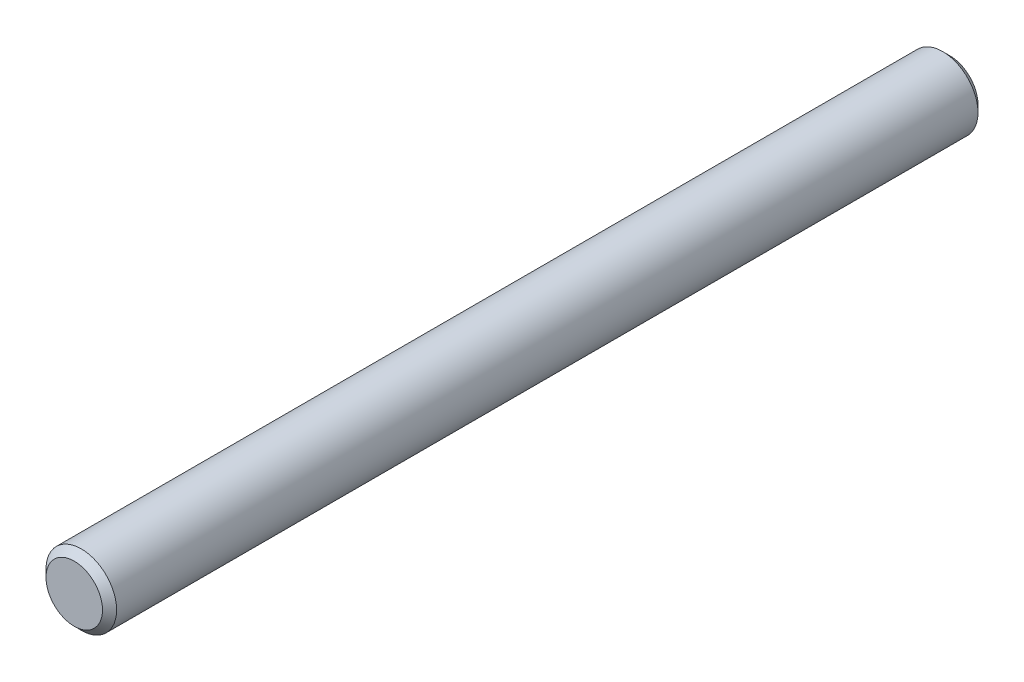
ISO-10303-21;
HEADER;
FILE_DESCRIPTION(('STEP AP214'),'2;1');
FILE_NAME('part.step','',(''),(''),'','','');
FILE_SCHEMA(('AUTOMOTIVE_DESIGN { 1 0 10303 214 1 1 1 1 }'));
ENDSEC;
DATA;
#1=APPLICATION_CONTEXT('core data for automotive mechanical design processes');
#2=APPLICATION_PROTOCOL_DEFINITION('international standard','automotive_design',2000,#1);
#3=PRODUCT_CONTEXT('',#1,'mechanical');
#4=PRODUCT('Part','Part','',(#3));
#5=PRODUCT_RELATED_PRODUCT_CATEGORY('part','',(#4));
#6=PRODUCT_DEFINITION_FORMATION('','',#4);
#7=PRODUCT_DEFINITION_CONTEXT('part definition',#1,'design');
#8=PRODUCT_DEFINITION('design','',#6,#7);
#9=PRODUCT_DEFINITION_SHAPE('','',#8);
#10=(LENGTH_UNIT() NAMED_UNIT(*) SI_UNIT(.MILLI.,.METRE.));
#11=(NAMED_UNIT(*) PLANE_ANGLE_UNIT() SI_UNIT($,.RADIAN.));
#12=(NAMED_UNIT(*) SI_UNIT($,.STERADIAN.) SOLID_ANGLE_UNIT());
#13=UNCERTAINTY_MEASURE_WITH_UNIT(LENGTH_MEASURE(1.E-05),#10,'distance_accuracy_value','');
#14=(GEOMETRIC_REPRESENTATION_CONTEXT(3) GLOBAL_UNCERTAINTY_ASSIGNED_CONTEXT((#13)) GLOBAL_UNIT_ASSIGNED_CONTEXT((#10,
#11,#12)) REPRESENTATION_CONTEXT('',''));
#15=CARTESIAN_POINT('',(0.,0.,0.));
#16=DIRECTION('',(0.,0.,1.));
#17=DIRECTION('',(1.,0.,0.));
#18=AXIS2_PLACEMENT_3D('',#15,#16,#17);
#19=CARTESIAN_POINT('',(0.,0.,62.));
#20=DIRECTION('',(0.,0.,-1.));
#21=DIRECTION('',(-1.,0.,0.));
#22=AXIS2_PLACEMENT_3D('',#19,#20,#21);
#23=CYLINDRICAL_SURFACE('',#22,2.5);
#24=CARTESIAN_POINT('',(0.,0.,0.49999999999998));
#25=DIRECTION('',(0.,0.,1.));
#26=DIRECTION('',(1.,0.,0.));
#27=AXIS2_PLACEMENT_3D('',#24,#25,#26);
#28=CIRCLE('',#27,2.5);
#29=CARTESIAN_POINT('',(2.5,0.,0.49999999999998));
#30=VERTEX_POINT('',#29);
#31=EDGE_CURVE('E41',#30,#30,#28,.T.);
#32=ORIENTED_EDGE('',*,*,#31,.T.);
#33=EDGE_LOOP('',(#32));
#34=FACE_BOUND('',#33,.T.);
#35=CARTESIAN_POINT('',(0.,0.,61.5));
#36=DIRECTION('',(0.,0.,1.));
#37=DIRECTION('',(1.,0.,0.));
#38=AXIS2_PLACEMENT_3D('',#35,#36,#37);
#39=CIRCLE('',#38,2.5);
#40=CARTESIAN_POINT('',(2.5,0.,61.5));
#41=VERTEX_POINT('',#40);
#42=EDGE_CURVE('E45',#41,#41,#39,.F.);
#43=ORIENTED_EDGE('',*,*,#42,.T.);
#44=EDGE_LOOP('',(#43));
#45=FACE_BOUND('',#44,.T.);
#46=ADVANCED_FACE('F30',(#34,#45),#23,.T.);
#47=CARTESIAN_POINT('',(0.,0.,62.));
#48=DIRECTION('',(0.,0.,1.));
#49=DIRECTION('',(1.,0.,0.));
#50=AXIS2_PLACEMENT_3D('',#47,#48,#49);
#51=PLANE('',#50);
#52=CARTESIAN_POINT('',(0.,0.,62.));
#53=DIRECTION('',(0.,0.,1.));
#54=DIRECTION('',(1.,0.,0.));
#55=AXIS2_PLACEMENT_3D('',#52,#53,#54);
#56=CIRCLE('',#55,2.);
#57=CARTESIAN_POINT('',(2.,0.,62.));
#58=VERTEX_POINT('',#57);
#59=EDGE_CURVE('E10',#58,#58,#56,.T.);
#60=ORIENTED_EDGE('',*,*,#59,.T.);
#61=EDGE_LOOP('',(#60));
#62=FACE_BOUND('',#61,.T.);
#63=ADVANCED_FACE('F61',(#62),#51,.T.);
#64=CARTESIAN_POINT('',(0.,0.,0.));
#65=DIRECTION('',(0.,0.,1.));
#66=DIRECTION('',(1.,0.,0.));
#67=AXIS2_PLACEMENT_3D('',#64,#65,#66);
#68=PLANE('',#67);
#69=CARTESIAN_POINT('',(0.,0.,0.));
#70=DIRECTION('',(0.,0.,1.));
#71=DIRECTION('',(1.,0.,0.));
#72=AXIS2_PLACEMENT_3D('',#69,#70,#71);
#73=CIRCLE('',#72,2.00000000000002);
#74=CARTESIAN_POINT('',(2.00000000000002,0.,0.));
#75=VERTEX_POINT('',#74);
#76=EDGE_CURVE('E37',#75,#75,#73,.F.);
#77=ORIENTED_EDGE('',*,*,#76,.T.);
#78=EDGE_LOOP('',(#77));
#79=FACE_BOUND('',#78,.T.);
#80=ADVANCED_FACE('F58',(#79),#68,.F.);
#81=CARTESIAN_POINT('',(0.,0.,0.49999999999998));
#82=DIRECTION('',(0.,0.,1.));
#83=DIRECTION('',(1.,0.,0.));
#84=AXIS2_PLACEMENT_3D('',#81,#82,#83);
#85=CONICAL_SURFACE('',#84,2.5,0.785398163397453);
#86=ORIENTED_EDGE('',*,*,#76,.F.);
#87=EDGE_LOOP('',(#86));
#88=FACE_BOUND('',#87,.T.);
#89=ORIENTED_EDGE('',*,*,#31,.F.);
#90=EDGE_LOOP('',(#89));
#91=FACE_BOUND('',#90,.T.);
#92=ADVANCED_FACE('F54',(#88,#91),#85,.T.);
#93=CARTESIAN_POINT('',(0.,0.,62.));
#94=DIRECTION('',(0.,0.,-1.));
#95=DIRECTION('',(-1.,0.,0.));
#96=AXIS2_PLACEMENT_3D('',#93,#94,#95);
#97=CONICAL_SURFACE('',#96,2.,0.785398163397439);
#98=ORIENTED_EDGE('',*,*,#42,.F.);
#99=EDGE_LOOP('',(#98));
#100=FACE_BOUND('',#99,.T.);
#101=ORIENTED_EDGE('',*,*,#59,.F.);
#102=EDGE_LOOP('',(#101));
#103=FACE_BOUND('',#102,.T.);
#104=ADVANCED_FACE('F32',(#100,#103),#97,.T.);
#105=CLOSED_SHELL('',(#46,#63,#80,#92,#104));
#106=MANIFOLD_SOLID_BREP('B2',#105);
#107=ADVANCED_BREP_SHAPE_REPRESENTATION('',(#18,#106),#14);
#108=SHAPE_DEFINITION_REPRESENTATION(#9,#107);
ENDSEC;
END-ISO-10303-21;
